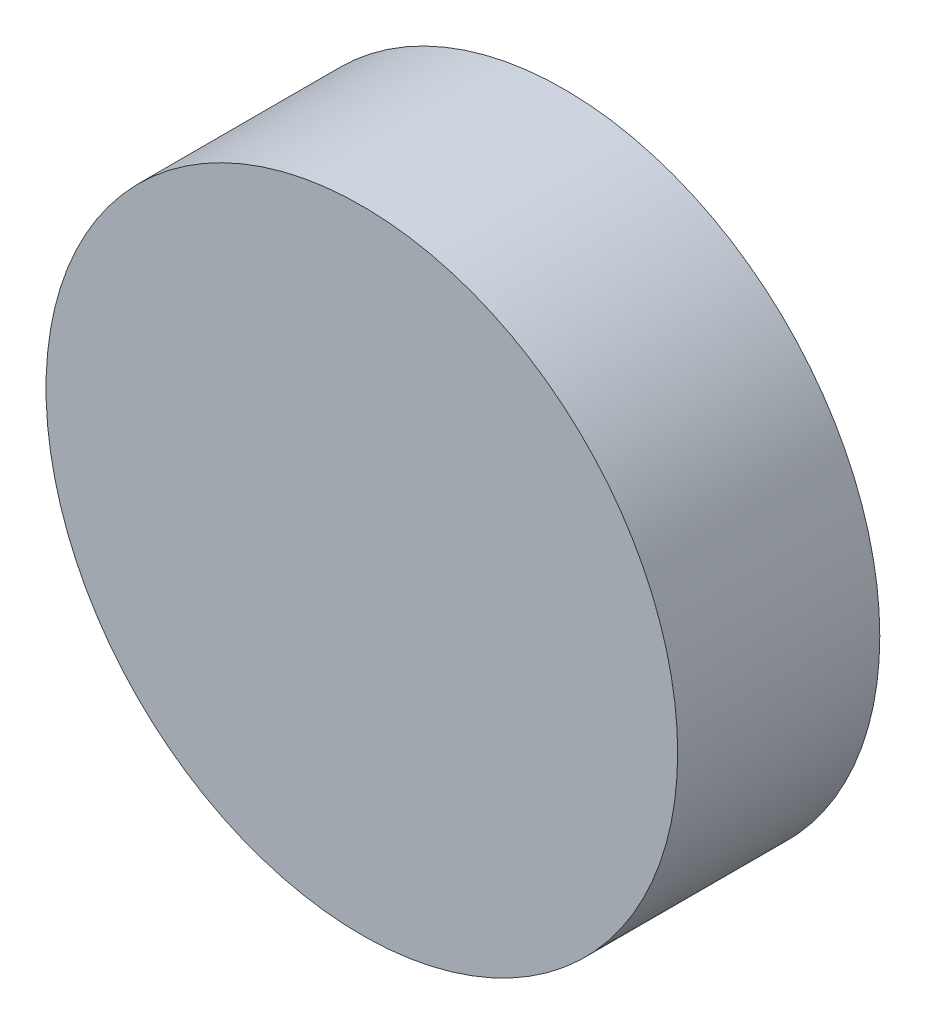
ISO-10303-21;
HEADER;
FILE_DESCRIPTION(('STEP AP214'),'2;1');
FILE_NAME('part.step','',(''),(''),'','','');
FILE_SCHEMA(('AUTOMOTIVE_DESIGN { 1 0 10303 214 1 1 1 1 }'));
ENDSEC;
DATA;
#1=APPLICATION_CONTEXT('core data for automotive mechanical design processes');
#2=APPLICATION_PROTOCOL_DEFINITION('international standard','automotive_design',2000,#1);
#3=PRODUCT_CONTEXT('',#1,'mechanical');
#4=PRODUCT('Part','Part','',(#3));
#5=PRODUCT_RELATED_PRODUCT_CATEGORY('part','',(#4));
#6=PRODUCT_DEFINITION_FORMATION('','',#4);
#7=PRODUCT_DEFINITION_CONTEXT('part definition',#1,'design');
#8=PRODUCT_DEFINITION('design','',#6,#7);
#9=PRODUCT_DEFINITION_SHAPE('','',#8);
#10=(LENGTH_UNIT() NAMED_UNIT(*) SI_UNIT(.MILLI.,.METRE.));
#11=(NAMED_UNIT(*) PLANE_ANGLE_UNIT() SI_UNIT($,.RADIAN.));
#12=(NAMED_UNIT(*) SI_UNIT($,.STERADIAN.) SOLID_ANGLE_UNIT());
#13=UNCERTAINTY_MEASURE_WITH_UNIT(LENGTH_MEASURE(1.E-05),#10,'distance_accuracy_value','');
#14=(GEOMETRIC_REPRESENTATION_CONTEXT(3) GLOBAL_UNCERTAINTY_ASSIGNED_CONTEXT((#13)) GLOBAL_UNIT_ASSIGNED_CONTEXT((#10,
#11,#12)) REPRESENTATION_CONTEXT('',''));
#15=CARTESIAN_POINT('',(0.,0.,0.));
#16=DIRECTION('',(0.,0.,1.));
#17=DIRECTION('',(1.,0.,0.));
#18=AXIS2_PLACEMENT_3D('',#15,#16,#17);
#19=CARTESIAN_POINT('',(0.,0.,1.6));
#20=DIRECTION('',(0.,0.,-1.));
#21=DIRECTION('',(-1.,0.,0.));
#22=AXIS2_PLACEMENT_3D('',#19,#20,#21);
#23=CYLINDRICAL_SURFACE('',#22,2.5);
#24=CARTESIAN_POINT('',(0.,0.,1.6));
#25=DIRECTION('',(0.,0.,1.));
#26=DIRECTION('',(1.,0.,0.));
#27=AXIS2_PLACEMENT_3D('',#24,#25,#26);
#28=CIRCLE('',#27,2.5);
#29=CARTESIAN_POINT('',(2.5,0.,1.6));
#30=VERTEX_POINT('',#29);
#31=EDGE_CURVE('E10',#30,#30,#28,.T.);
#32=ORIENTED_EDGE('',*,*,#31,.F.);
#33=EDGE_LOOP('',(#32));
#34=FACE_BOUND('',#33,.T.);
#35=CARTESIAN_POINT('',(0.,0.,0.));
#36=DIRECTION('',(0.,0.,1.));
#37=DIRECTION('',(1.,0.,0.));
#38=AXIS2_PLACEMENT_3D('',#35,#36,#37);
#39=CIRCLE('',#38,2.5);
#40=CARTESIAN_POINT('',(2.5,0.,0.));
#41=VERTEX_POINT('',#40);
#42=EDGE_CURVE('E40',#41,#41,#39,.T.);
#43=ORIENTED_EDGE('',*,*,#42,.T.);
#44=EDGE_LOOP('',(#43));
#45=FACE_BOUND('',#44,.T.);
#46=ADVANCED_FACE('F37',(#34,#45),#23,.T.);
#47=CARTESIAN_POINT('',(0.,0.,1.6));
#48=DIRECTION('',(0.,0.,1.));
#49=DIRECTION('',(1.,0.,0.));
#50=AXIS2_PLACEMENT_3D('',#47,#48,#49);
#51=PLANE('',#50);
#52=ORIENTED_EDGE('',*,*,#31,.T.);
#53=EDGE_LOOP('',(#52));
#54=FACE_BOUND('',#53,.T.);
#55=ADVANCED_FACE('F54',(#54),#51,.T.);
#56=CARTESIAN_POINT('',(0.,0.,0.));
#57=DIRECTION('',(0.,0.,1.));
#58=DIRECTION('',(1.,0.,0.));
#59=AXIS2_PLACEMENT_3D('',#56,#57,#58);
#60=PLANE('',#59);
#61=ORIENTED_EDGE('',*,*,#42,.F.);
#62=EDGE_LOOP('',(#61));
#63=FACE_BOUND('',#62,.T.);
#64=ADVANCED_FACE('F52',(#63),#60,.F.);
#65=CLOSED_SHELL('',(#46,#55,#64));
#66=MANIFOLD_SOLID_BREP('B2',#65);
#67=ADVANCED_BREP_SHAPE_REPRESENTATION('',(#18,#66),#14);
#68=SHAPE_DEFINITION_REPRESENTATION(#9,#67);
ENDSEC;
END-ISO-10303-21;
